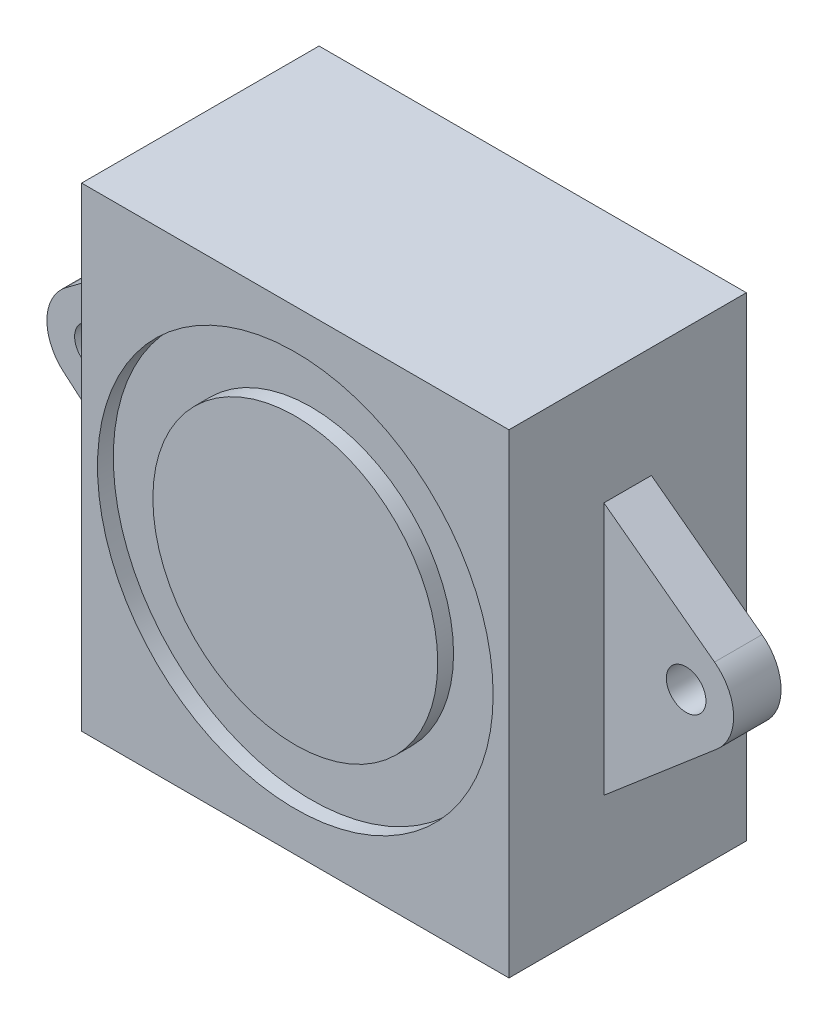
ISO-10303-21;
HEADER;
FILE_DESCRIPTION(('STEP AP214'),'2;1');
FILE_NAME('part.step','',(''),(''),'','','');
FILE_SCHEMA(('AUTOMOTIVE_DESIGN { 1 0 10303 214 1 1 1 1 }'));
ENDSEC;
DATA;
#1=APPLICATION_CONTEXT('core data for automotive mechanical design processes');
#2=APPLICATION_PROTOCOL_DEFINITION('international standard','automotive_design',2000,#1);
#3=PRODUCT_CONTEXT('',#1,'mechanical');
#4=PRODUCT('Part','Part','',(#3));
#5=PRODUCT_RELATED_PRODUCT_CATEGORY('part','',(#4));
#6=PRODUCT_DEFINITION_FORMATION('','',#4);
#7=PRODUCT_DEFINITION_CONTEXT('part definition',#1,'design');
#8=PRODUCT_DEFINITION('design','',#6,#7);
#9=PRODUCT_DEFINITION_SHAPE('','',#8);
#10=(LENGTH_UNIT() NAMED_UNIT(*) SI_UNIT(.MILLI.,.METRE.));
#11=(NAMED_UNIT(*) PLANE_ANGLE_UNIT() SI_UNIT($,.RADIAN.));
#12=(NAMED_UNIT(*) SI_UNIT($,.STERADIAN.) SOLID_ANGLE_UNIT());
#13=UNCERTAINTY_MEASURE_WITH_UNIT(LENGTH_MEASURE(1.E-05),#10,'distance_accuracy_value','');
#14=(GEOMETRIC_REPRESENTATION_CONTEXT(3) GLOBAL_UNCERTAINTY_ASSIGNED_CONTEXT((#13)) GLOBAL_UNIT_ASSIGNED_CONTEXT((#10,
#11,#12)) REPRESENTATION_CONTEXT('',''));
#15=CARTESIAN_POINT('',(0.,0.,0.));
#16=DIRECTION('',(0.,0.,1.));
#17=DIRECTION('',(1.,0.,0.));
#18=AXIS2_PLACEMENT_3D('',#15,#16,#17);
#19=CARTESIAN_POINT('',(-11.0249303933751,14.7712245140367,6.));
#20=DIRECTION('',(-0.598141159941193,0.801390761603978,0.));
#21=DIRECTION('',(-0.801390761603978,-0.598141159941193,0.));
#22=AXIS2_PLACEMENT_3D('',#19,#20,#21);
#23=PLANE('',#22);
#24=DIRECTION('',(0.,0.,1.));
#25=VECTOR('',#24,1.);
#26=CARTESIAN_POINT('',(-6.98951234528994,17.7831754221033,6.));
#27=LINE('',#26,#25);
#28=CARTESIAN_POINT('',(-6.98951234528994,17.7831754221033,6.));
#29=VERTEX_POINT('',#28);
#30=CARTESIAN_POINT('',(-6.98951234528994,17.7831754221033,9.));
#31=VERTEX_POINT('',#30);
#32=EDGE_CURVE('E140',#29,#31,#27,.T.);
#33=ORIENTED_EDGE('',*,*,#32,.T.);
#34=DIRECTION('',(0.801390761603978,0.598141159941193,0.));
#35=VECTOR('',#34,1.);
#36=CARTESIAN_POINT('',(-11.0249303933751,14.7712245140367,9.));
#37=LINE('',#36,#35);
#38=CARTESIAN_POINT('',(0.,23.,9.));
#39=VERTEX_POINT('',#38);
#40=EDGE_CURVE('E52',#31,#39,#37,.T.);
#41=ORIENTED_EDGE('',*,*,#40,.T.);
#42=DIRECTION('',(0.,0.,1.));
#43=VECTOR('',#42,1.);
#44=CARTESIAN_POINT('',(0.,23.,6.));
#45=LINE('',#44,#43);
#46=CARTESIAN_POINT('',(0.,23.,6.));
#47=VERTEX_POINT('',#46);
#48=EDGE_CURVE('E138',#47,#39,#45,.T.);
#49=ORIENTED_EDGE('',*,*,#48,.F.);
#50=DIRECTION('',(-0.801390761603978,-0.598141159941193,0.));
#51=VECTOR('',#50,1.);
#52=CARTESIAN_POINT('',(-11.0249303933751,14.7712245140367,6.));
#53=LINE('',#52,#51);
#54=EDGE_CURVE('E235',#47,#29,#53,.T.);
#55=ORIENTED_EDGE('',*,*,#54,.T.);
#56=EDGE_LOOP('',(#33,#41,#49,#55));
#57=FACE_BOUND('',#56,.T.);
#58=ADVANCED_FACE('F37',(#57),#23,.T.);
#59=CARTESIAN_POINT('',(3.45661763723507,4.04935827103577,6.));
#60=DIRECTION('',(-0.649245906413656,-0.760578564650037,0.));
#61=DIRECTION('',(0.760578564650037,-0.649245906413656,0.));
#62=AXIS2_PLACEMENT_3D('',#59,#60,#61);
#63=PLANE('',#62);
#64=DIRECTION('',(0.,0.,1.));
#65=VECTOR('',#64,1.);
#66=CARTESIAN_POINT('',(0.,7.,6.));
#67=LINE('',#66,#65);
#68=CARTESIAN_POINT('',(0.,7.,6.));
#69=VERTEX_POINT('',#68);
#70=CARTESIAN_POINT('',(0.,7.,9.));
#71=VERTEX_POINT('',#70);
#72=EDGE_CURVE('E146',#69,#71,#67,.T.);
#73=ORIENTED_EDGE('',*,*,#72,.T.);
#74=DIRECTION('',(-0.760578564650037,0.649245906413656,0.));
#75=VECTOR('',#74,1.);
#76=CARTESIAN_POINT('',(3.45661763723507,4.04935827103577,9.));
#77=LINE('',#76,#75);
#78=CARTESIAN_POINT('',(-7.14282658470733,13.0972674433412,9.));
#79=VERTEX_POINT('',#78);
#80=EDGE_CURVE('E127',#71,#79,#77,.T.);
#81=ORIENTED_EDGE('',*,*,#80,.T.);
#82=DIRECTION('',(0.,0.,1.));
#83=VECTOR('',#82,1.);
#84=CARTESIAN_POINT('',(-7.14282658470733,13.0972674433412,6.));
#85=LINE('',#84,#83);
#86=CARTESIAN_POINT('',(-7.14282658470733,13.0972674433412,6.));
#87=VERTEX_POINT('',#86);
#88=EDGE_CURVE('E151',#87,#79,#85,.T.);
#89=ORIENTED_EDGE('',*,*,#88,.F.);
#90=DIRECTION('',(0.760578564650037,-0.649245906413656,0.));
#91=VECTOR('',#90,1.);
#92=CARTESIAN_POINT('',(3.45661763723507,4.04935827103577,6.));
#93=LINE('',#92,#91);
#94=EDGE_CURVE('E239',#87,#69,#93,.T.);
#95=ORIENTED_EDGE('',*,*,#94,.T.);
#96=EDGE_LOOP('',(#73,#81,#89,#95));
#97=FACE_BOUND('',#96,.T.);
#98=ADVANCED_FACE('F248',(#97),#63,.T.);
#99=CARTESIAN_POINT('',(-5.19508886546636,15.3790031372913,6.));
#100=DIRECTION('',(0.,0.,1.));
#101=DIRECTION('',(1.,0.,0.));
#102=AXIS2_PLACEMENT_3D('',#99,#100,#101);
#103=CYLINDRICAL_SURFACE('',#102,1.25);
#104=CARTESIAN_POINT('',(-5.19508886546636,15.3790031372913,6.));
#105=DIRECTION('',(0.,0.,1.));
#106=DIRECTION('',(1.,0.,0.));
#107=AXIS2_PLACEMENT_3D('',#104,#105,#106);
#108=CIRCLE('',#107,1.25);
#109=CARTESIAN_POINT('',(-3.94508886546636,15.3790031372913,6.));
#110=VERTEX_POINT('',#109);
#111=EDGE_CURVE('E224',#110,#110,#108,.T.);
#112=ORIENTED_EDGE('',*,*,#111,.F.);
#113=EDGE_LOOP('',(#112));
#114=FACE_BOUND('',#113,.T.);
#115=CARTESIAN_POINT('',(-5.19508886546636,15.3790031372913,9.));
#116=DIRECTION('',(0.,0.,1.));
#117=DIRECTION('',(1.,0.,0.));
#118=AXIS2_PLACEMENT_3D('',#115,#116,#117);
#119=CIRCLE('',#118,1.25);
#120=CARTESIAN_POINT('',(-3.94508886546636,15.3790031372913,9.));
#121=VERTEX_POINT('',#120);
#122=EDGE_CURVE('E141',#121,#121,#119,.F.);
#123=ORIENTED_EDGE('',*,*,#122,.F.);
#124=EDGE_LOOP('',(#123));
#125=FACE_BOUND('',#124,.T.);
#126=ADVANCED_FACE('F250',(#114,#125),#103,.F.);
#127=CARTESIAN_POINT('',(-5.19508886546636,15.3790031372913,6.));
#128=DIRECTION('',(0.,0.,1.));
#129=DIRECTION('',(1.,0.,0.));
#130=AXIS2_PLACEMENT_3D('',#127,#128,#129);
#131=CYLINDRICAL_SURFACE('',#130,3.);
#132=ORIENTED_EDGE('',*,*,#88,.T.);
#133=CARTESIAN_POINT('',(-5.19508886546636,15.3790031372913,9.));
#134=DIRECTION('',(0.,0.,1.));
#135=DIRECTION('',(1.,0.,0.));
#136=AXIS2_PLACEMENT_3D('',#133,#134,#135);
#137=CIRCLE('',#136,3.);
#138=EDGE_CURVE('E11',#79,#31,#137,.F.);
#139=ORIENTED_EDGE('',*,*,#138,.T.);
#140=ORIENTED_EDGE('',*,*,#32,.F.);
#141=CARTESIAN_POINT('',(-5.19508886546636,15.3790031372913,6.));
#142=DIRECTION('',(0.,0.,1.));
#143=DIRECTION('',(1.,0.,0.));
#144=AXIS2_PLACEMENT_3D('',#141,#142,#143);
#145=CIRCLE('',#144,3.);
#146=EDGE_CURVE('E237',#29,#87,#145,.T.);
#147=ORIENTED_EDGE('',*,*,#146,.T.);
#148=EDGE_LOOP('',(#132,#139,#140,#147));
#149=FACE_BOUND('',#148,.T.);
#150=ADVANCED_FACE('F247',(#149),#131,.T.);
#151=CARTESIAN_POINT('',(32.1950888654664,15.3790031372913,6.));
#152=DIRECTION('',(0.,0.,1.));
#153=DIRECTION('',(1.,0.,0.));
#154=AXIS2_PLACEMENT_3D('',#151,#152,#153);
#155=CYLINDRICAL_SURFACE('',#154,3.);
#156=CARTESIAN_POINT('',(32.1950888654664,15.3790031372913,9.));
#157=DIRECTION('',(0.,0.,1.));
#158=DIRECTION('',(1.,0.,0.));
#159=AXIS2_PLACEMENT_3D('',#156,#157,#158);
#160=CIRCLE('',#159,3.);
#161=CARTESIAN_POINT('',(34.1428265847073,13.0972674433412,9.));
#162=VERTEX_POINT('',#161);
#163=CARTESIAN_POINT('',(33.9895123452899,17.7831754221033,9.));
#164=VERTEX_POINT('',#163);
#165=EDGE_CURVE('E59',#162,#164,#160,.T.);
#166=ORIENTED_EDGE('',*,*,#165,.F.);
#167=DIRECTION('',(0.,0.,1.));
#168=VECTOR('',#167,1.);
#169=CARTESIAN_POINT('',(34.1428265847073,13.0972674433412,6.));
#170=LINE('',#169,#168);
#171=CARTESIAN_POINT('',(34.1428265847073,13.0972674433412,6.));
#172=VERTEX_POINT('',#171);
#173=EDGE_CURVE('E221',#172,#162,#170,.T.);
#174=ORIENTED_EDGE('',*,*,#173,.F.);
#175=CARTESIAN_POINT('',(32.1950888654664,15.3790031372913,6.));
#176=DIRECTION('',(0.,0.,1.));
#177=DIRECTION('',(1.,0.,0.));
#178=AXIS2_PLACEMENT_3D('',#175,#176,#177);
#179=CIRCLE('',#178,3.);
#180=CARTESIAN_POINT('',(33.9895123452899,17.7831754221033,6.));
#181=VERTEX_POINT('',#180);
#182=EDGE_CURVE('E208',#181,#172,#179,.F.);
#183=ORIENTED_EDGE('',*,*,#182,.F.);
#184=DIRECTION('',(0.,0.,1.));
#185=VECTOR('',#184,1.);
#186=CARTESIAN_POINT('',(33.9895123452899,17.7831754221033,6.));
#187=LINE('',#186,#185);
#188=EDGE_CURVE('E220',#181,#164,#187,.T.);
#189=ORIENTED_EDGE('',*,*,#188,.T.);
#190=EDGE_LOOP('',(#166,#174,#183,#189));
#191=FACE_BOUND('',#190,.T.);
#192=ADVANCED_FACE('F263',(#191),#155,.T.);
#193=CARTESIAN_POINT('',(7.92442903162695,-9.28330975829951,6.));
#194=DIRECTION('',(-0.649245906413656,0.760578564650037,0.));
#195=DIRECTION('',(-0.760578564650037,-0.649245906413656,0.));
#196=AXIS2_PLACEMENT_3D('',#193,#194,#195);
#197=PLANE('',#196);
#198=DIRECTION('',(0.760578564650037,0.649245906413656,0.));
#199=VECTOR('',#198,1.);
#200=CARTESIAN_POINT('',(7.92442903162695,-9.28330975829951,9.));
#201=LINE('',#200,#199);
#202=CARTESIAN_POINT('',(27.,7.,9.));
#203=VERTEX_POINT('',#202);
#204=EDGE_CURVE('E200',#203,#162,#201,.T.);
#205=ORIENTED_EDGE('',*,*,#204,.F.);
#206=DIRECTION('',(0.,0.,1.));
#207=VECTOR('',#206,1.);
#208=CARTESIAN_POINT('',(27.,7.,6.));
#209=LINE('',#208,#207);
#210=CARTESIAN_POINT('',(27.,7.,6.));
#211=VERTEX_POINT('',#210);
#212=EDGE_CURVE('E225',#211,#203,#209,.T.);
#213=ORIENTED_EDGE('',*,*,#212,.F.);
#214=DIRECTION('',(-0.760578564650037,-0.649245906413656,0.));
#215=VECTOR('',#214,1.);
#216=CARTESIAN_POINT('',(7.92442903162695,-9.28330975829951,6.));
#217=LINE('',#216,#215);
#218=EDGE_CURVE('E215',#172,#211,#217,.T.);
#219=ORIENTED_EDGE('',*,*,#218,.F.);
#220=ORIENTED_EDGE('',*,*,#173,.T.);
#221=EDGE_LOOP('',(#205,#213,#219,#220));
#222=FACE_BOUND('',#221,.T.);
#223=ADVANCED_FACE('F328',(#222),#197,.F.);
#224=CARTESIAN_POINT('',(20.6847972682016,27.7135341062596,6.));
#225=DIRECTION('',(-0.598141159941193,-0.801390761603978,0.));
#226=DIRECTION('',(0.801390761603978,-0.598141159941193,0.));
#227=AXIS2_PLACEMENT_3D('',#224,#225,#226);
#228=PLANE('',#227);
#229=DIRECTION('',(-0.801390761603978,0.598141159941193,0.));
#230=VECTOR('',#229,1.);
#231=CARTESIAN_POINT('',(20.6847972682016,27.7135341062596,9.));
#232=LINE('',#231,#230);
#233=CARTESIAN_POINT('',(27.,23.,9.));
#234=VERTEX_POINT('',#233);
#235=EDGE_CURVE('E195',#164,#234,#232,.T.);
#236=ORIENTED_EDGE('',*,*,#235,.F.);
#237=ORIENTED_EDGE('',*,*,#188,.F.);
#238=DIRECTION('',(0.801390761603978,-0.598141159941193,0.));
#239=VECTOR('',#238,1.);
#240=CARTESIAN_POINT('',(20.6847972682016,27.7135341062596,6.));
#241=LINE('',#240,#239);
#242=CARTESIAN_POINT('',(27.,23.,6.));
#243=VERTEX_POINT('',#242);
#244=EDGE_CURVE('E211',#243,#181,#241,.T.);
#245=ORIENTED_EDGE('',*,*,#244,.F.);
#246=DIRECTION('',(0.,0.,1.));
#247=VECTOR('',#246,1.);
#248=CARTESIAN_POINT('',(27.,23.,6.));
#249=LINE('',#248,#247);
#250=EDGE_CURVE('E228',#243,#234,#249,.T.);
#251=ORIENTED_EDGE('',*,*,#250,.T.);
#252=EDGE_LOOP('',(#236,#237,#245,#251));
#253=FACE_BOUND('',#252,.T.);
#254=ADVANCED_FACE('F318',(#253),#228,.F.);
#255=CARTESIAN_POINT('',(32.1950888654664,15.3790031372913,6.));
#256=DIRECTION('',(0.,0.,1.));
#257=DIRECTION('',(1.,0.,0.));
#258=AXIS2_PLACEMENT_3D('',#255,#256,#257);
#259=CYLINDRICAL_SURFACE('',#258,1.25);
#260=CARTESIAN_POINT('',(32.1950888654664,15.3790031372913,6.));
#261=DIRECTION('',(0.,0.,1.));
#262=DIRECTION('',(1.,0.,0.));
#263=AXIS2_PLACEMENT_3D('',#260,#261,#262);
#264=CIRCLE('',#263,1.25);
#265=CARTESIAN_POINT('',(33.4450888654664,15.3790031372913,6.));
#266=VERTEX_POINT('',#265);
#267=EDGE_CURVE('E217',#266,#266,#264,.F.);
#268=ORIENTED_EDGE('',*,*,#267,.T.);
#269=EDGE_LOOP('',(#268));
#270=FACE_BOUND('',#269,.T.);
#271=CARTESIAN_POINT('',(32.1950888654664,15.3790031372913,9.));
#272=DIRECTION('',(0.,0.,1.));
#273=DIRECTION('',(1.,0.,0.));
#274=AXIS2_PLACEMENT_3D('',#271,#272,#273);
#275=CIRCLE('',#274,1.25);
#276=CARTESIAN_POINT('',(33.4450888654664,15.3790031372913,9.));
#277=VERTEX_POINT('',#276);
#278=EDGE_CURVE('E132',#277,#277,#275,.T.);
#279=ORIENTED_EDGE('',*,*,#278,.T.);
#280=EDGE_LOOP('',(#279));
#281=FACE_BOUND('',#280,.T.);
#282=ADVANCED_FACE('F293',(#270,#281),#259,.F.);
#283=CARTESIAN_POINT('',(27.,0.,15.));
#284=DIRECTION('',(-1.,0.,0.));
#285=DIRECTION('',(0.,0.,1.));
#286=AXIS2_PLACEMENT_3D('',#283,#284,#285);
#287=PLANE('',#286);
#288=DIRECTION('',(0.,0.,-1.));
#289=VECTOR('',#288,1.);
#290=CARTESIAN_POINT('',(27.,30.,15.));
#291=LINE('',#290,#289);
#292=CARTESIAN_POINT('',(27.,30.,15.));
#293=VERTEX_POINT('',#292);
#294=CARTESIAN_POINT('',(27.,30.,0.));
#295=VERTEX_POINT('',#294);
#296=EDGE_CURVE('E187',#293,#295,#291,.T.);
#297=ORIENTED_EDGE('',*,*,#296,.F.);
#298=DIRECTION('',(0.,1.,0.));
#299=VECTOR('',#298,1.);
#300=CARTESIAN_POINT('',(27.,0.,15.));
#301=LINE('',#300,#299);
#302=CARTESIAN_POINT('',(27.,0.,15.));
#303=VERTEX_POINT('',#302);
#304=EDGE_CURVE('E173',#303,#293,#301,.T.);
#305=ORIENTED_EDGE('',*,*,#304,.F.);
#306=DIRECTION('',(0.,0.,-1.));
#307=VECTOR('',#306,1.);
#308=CARTESIAN_POINT('',(27.,0.,15.));
#309=LINE('',#308,#307);
#310=CARTESIAN_POINT('',(27.,0.,0.));
#311=VERTEX_POINT('',#310);
#312=EDGE_CURVE('E190',#303,#311,#309,.T.);
#313=ORIENTED_EDGE('',*,*,#312,.T.);
#314=DIRECTION('',(0.,1.,0.));
#315=VECTOR('',#314,1.);
#316=CARTESIAN_POINT('',(27.,0.,0.));
#317=LINE('',#316,#315);
#318=EDGE_CURVE('E182',#311,#295,#317,.T.);
#319=ORIENTED_EDGE('',*,*,#318,.T.);
#320=EDGE_LOOP('',(#297,#305,#313,#319));
#321=FACE_BOUND('',#320,.T.);
#322=ORIENTED_EDGE('',*,*,#250,.F.);
#323=DIRECTION('',(0.,1.,0.));
#324=VECTOR('',#323,1.);
#325=CARTESIAN_POINT('',(27.,0.,6.));
#326=LINE('',#325,#324);
#327=EDGE_CURVE('E213',#211,#243,#326,.T.);
#328=ORIENTED_EDGE('',*,*,#327,.F.);
#329=ORIENTED_EDGE('',*,*,#212,.T.);
#330=DIRECTION('',(0.,-1.,0.));
#331=VECTOR('',#330,1.);
#332=CARTESIAN_POINT('',(27.,23.,9.));
#333=LINE('',#332,#331);
#334=EDGE_CURVE('E133',#234,#203,#333,.T.);
#335=ORIENTED_EDGE('',*,*,#334,.F.);
#336=EDGE_LOOP('',(#322,#328,#329,#335));
#337=FACE_BOUND('',#336,.T.);
#338=ADVANCED_FACE('F291',(#321,#337),#287,.F.);
#339=CARTESIAN_POINT('',(0.,0.,15.));
#340=DIRECTION('',(1.,0.,0.));
#341=DIRECTION('',(0.,0.,-1.));
#342=AXIS2_PLACEMENT_3D('',#339,#340,#341);
#343=PLANE('',#342);
#344=DIRECTION('',(0.,0.,-1.));
#345=VECTOR('',#344,1.);
#346=CARTESIAN_POINT('',(0.,0.,15.));
#347=LINE('',#346,#345);
#348=CARTESIAN_POINT('',(0.,0.,15.));
#349=VERTEX_POINT('',#348);
#350=CARTESIAN_POINT('',(0.,0.,0.));
#351=VERTEX_POINT('',#350);
#352=EDGE_CURVE('E45',#349,#351,#347,.T.);
#353=ORIENTED_EDGE('',*,*,#352,.F.);
#354=DIRECTION('',(0.,-1.,0.));
#355=VECTOR('',#354,1.);
#356=CARTESIAN_POINT('',(0.,0.,15.));
#357=LINE('',#356,#355);
#358=CARTESIAN_POINT('',(0.,30.,15.));
#359=VERTEX_POINT('',#358);
#360=EDGE_CURVE('E168',#359,#349,#357,.T.);
#361=ORIENTED_EDGE('',*,*,#360,.F.);
#362=DIRECTION('',(0.,0.,-1.));
#363=VECTOR('',#362,1.);
#364=CARTESIAN_POINT('',(0.,30.,15.));
#365=LINE('',#364,#363);
#366=CARTESIAN_POINT('',(0.,30.,0.));
#367=VERTEX_POINT('',#366);
#368=EDGE_CURVE('E177',#359,#367,#365,.T.);
#369=ORIENTED_EDGE('',*,*,#368,.T.);
#370=DIRECTION('',(0.,-1.,0.));
#371=VECTOR('',#370,1.);
#372=CARTESIAN_POINT('',(0.,0.,0.));
#373=LINE('',#372,#371);
#374=EDGE_CURVE('E165',#367,#351,#373,.T.);
#375=ORIENTED_EDGE('',*,*,#374,.T.);
#376=EDGE_LOOP('',(#353,#361,#369,#375));
#377=FACE_BOUND('',#376,.T.);
#378=ORIENTED_EDGE('',*,*,#72,.F.);
#379=DIRECTION('',(0.,-1.,0.));
#380=VECTOR('',#379,1.);
#381=CARTESIAN_POINT('',(0.,0.,6.));
#382=LINE('',#381,#380);
#383=EDGE_CURVE('E144',#47,#69,#382,.T.);
#384=ORIENTED_EDGE('',*,*,#383,.F.);
#385=ORIENTED_EDGE('',*,*,#48,.T.);
#386=DIRECTION('',(0.,1.,0.));
#387=VECTOR('',#386,1.);
#388=CARTESIAN_POINT('',(0.,7.,9.));
#389=LINE('',#388,#387);
#390=EDGE_CURVE('E123',#71,#39,#389,.T.);
#391=ORIENTED_EDGE('',*,*,#390,.F.);
#392=EDGE_LOOP('',(#378,#384,#385,#391));
#393=FACE_BOUND('',#392,.T.);
#394=ADVANCED_FACE('F39',(#377,#393),#343,.F.);
#395=CARTESIAN_POINT('',(0.,0.,15.));
#396=DIRECTION('',(0.,1.,0.));
#397=DIRECTION('',(0.,0.,1.));
#398=AXIS2_PLACEMENT_3D('',#395,#396,#397);
#399=PLANE('',#398);
#400=DIRECTION('',(1.,0.,0.));
#401=VECTOR('',#400,1.);
#402=CARTESIAN_POINT('',(0.,0.,0.));
#403=LINE('',#402,#401);
#404=EDGE_CURVE('E180',#351,#311,#403,.T.);
#405=ORIENTED_EDGE('',*,*,#404,.T.);
#406=ORIENTED_EDGE('',*,*,#312,.F.);
#407=DIRECTION('',(1.,0.,0.));
#408=VECTOR('',#407,1.);
#409=CARTESIAN_POINT('',(0.,0.,15.));
#410=LINE('',#409,#408);
#411=EDGE_CURVE('E170',#349,#303,#410,.T.);
#412=ORIENTED_EDGE('',*,*,#411,.F.);
#413=ORIENTED_EDGE('',*,*,#352,.T.);
#414=EDGE_LOOP('',(#405,#406,#412,#413));
#415=FACE_BOUND('',#414,.T.);
#416=ADVANCED_FACE('F289',(#415),#399,.F.);
#417=CARTESIAN_POINT('',(0.,30.,15.));
#418=DIRECTION('',(0.,-1.,0.));
#419=DIRECTION('',(0.,0.,-1.));
#420=AXIS2_PLACEMENT_3D('',#417,#418,#419);
#421=PLANE('',#420);
#422=DIRECTION('',(-1.,0.,0.));
#423=VECTOR('',#422,1.);
#424=CARTESIAN_POINT('',(0.,30.,0.));
#425=LINE('',#424,#423);
#426=EDGE_CURVE('E171',#295,#367,#425,.T.);
#427=ORIENTED_EDGE('',*,*,#426,.T.);
#428=ORIENTED_EDGE('',*,*,#368,.F.);
#429=DIRECTION('',(-1.,0.,0.));
#430=VECTOR('',#429,1.);
#431=CARTESIAN_POINT('',(0.,30.,15.));
#432=LINE('',#431,#430);
#433=EDGE_CURVE('E175',#293,#359,#432,.T.);
#434=ORIENTED_EDGE('',*,*,#433,.F.);
#435=ORIENTED_EDGE('',*,*,#296,.T.);
#436=EDGE_LOOP('',(#427,#428,#434,#435));
#437=FACE_BOUND('',#436,.T.);
#438=ADVANCED_FACE('F282',(#437),#421,.F.);
#439=CARTESIAN_POINT('',(0.,0.,15.));
#440=DIRECTION('',(0.,0.,-1.));
#441=DIRECTION('',(-1.,0.,0.));
#442=AXIS2_PLACEMENT_3D('',#439,#440,#441);
#443=PLANE('',#442);
#444=CARTESIAN_POINT('',(13.5,15.,15.));
#445=DIRECTION('',(0.,0.,1.));
#446=DIRECTION('',(1.,0.,0.));
#447=AXIS2_PLACEMENT_3D('',#444,#445,#446);
#448=CIRCLE('',#447,12.5);
#449=CARTESIAN_POINT('',(26.,15.,15.));
#450=VERTEX_POINT('',#449);
#451=EDGE_CURVE('E160',#450,#450,#448,.T.);
#452=ORIENTED_EDGE('',*,*,#451,.F.);
#453=EDGE_LOOP('',(#452));
#454=FACE_BOUND('',#453,.T.);
#455=ORIENTED_EDGE('',*,*,#360,.T.);
#456=ORIENTED_EDGE('',*,*,#411,.T.);
#457=ORIENTED_EDGE('',*,*,#304,.T.);
#458=ORIENTED_EDGE('',*,*,#433,.T.);
#459=EDGE_LOOP('',(#455,#456,#457,#458));
#460=FACE_BOUND('',#459,.T.);
#461=ADVANCED_FACE('F279',(#454,#460),#443,.F.);
#462=CARTESIAN_POINT('',(0.,0.,0.));
#463=DIRECTION('',(0.,0.,-1.));
#464=DIRECTION('',(-1.,0.,0.));
#465=AXIS2_PLACEMENT_3D('',#462,#463,#464);
#466=PLANE('',#465);
#467=ORIENTED_EDGE('',*,*,#374,.F.);
#468=ORIENTED_EDGE('',*,*,#426,.F.);
#469=ORIENTED_EDGE('',*,*,#318,.F.);
#470=ORIENTED_EDGE('',*,*,#404,.F.);
#471=EDGE_LOOP('',(#467,#468,#469,#470));
#472=FACE_BOUND('',#471,.T.);
#473=ADVANCED_FACE('F277',(#472),#466,.T.);
#474=CARTESIAN_POINT('',(13.5,15.,14.));
#475=DIRECTION('',(0.,0.,1.));
#476=DIRECTION('',(1.,0.,0.));
#477=AXIS2_PLACEMENT_3D('',#474,#475,#476);
#478=CYLINDRICAL_SURFACE('',#477,12.5);
#479=CARTESIAN_POINT('',(13.5,15.,14.));
#480=DIRECTION('',(0.,0.,1.));
#481=DIRECTION('',(1.,0.,0.));
#482=AXIS2_PLACEMENT_3D('',#479,#480,#481);
#483=CIRCLE('',#482,12.5);
#484=CARTESIAN_POINT('',(26.,15.,14.));
#485=VERTEX_POINT('',#484);
#486=EDGE_CURVE('E162',#485,#485,#483,.T.);
#487=ORIENTED_EDGE('',*,*,#486,.F.);
#488=EDGE_LOOP('',(#487));
#489=FACE_BOUND('',#488,.T.);
#490=ORIENTED_EDGE('',*,*,#451,.T.);
#491=EDGE_LOOP('',(#490));
#492=FACE_BOUND('',#491,.T.);
#493=ADVANCED_FACE('F273',(#489,#492),#478,.F.);
#494=CARTESIAN_POINT('',(13.5,15.,14.));
#495=DIRECTION('',(0.,0.,1.));
#496=DIRECTION('',(1.,0.,0.));
#497=AXIS2_PLACEMENT_3D('',#494,#495,#496);
#498=PLANE('',#497);
#499=CARTESIAN_POINT('',(13.5,15.,14.));
#500=DIRECTION('',(0.,0.,1.));
#501=DIRECTION('',(1.,0.,0.));
#502=AXIS2_PLACEMENT_3D('',#499,#500,#501);
#503=CIRCLE('',#502,9.);
#504=CARTESIAN_POINT('',(22.5,15.,14.));
#505=VERTEX_POINT('',#504);
#506=EDGE_CURVE('E149',#505,#505,#503,.T.);
#507=ORIENTED_EDGE('',*,*,#506,.F.);
#508=EDGE_LOOP('',(#507));
#509=FACE_BOUND('',#508,.T.);
#510=ORIENTED_EDGE('',*,*,#486,.T.);
#511=EDGE_LOOP('',(#510));
#512=FACE_BOUND('',#511,.T.);
#513=ADVANCED_FACE('F269',(#509,#512),#498,.T.);
#514=CARTESIAN_POINT('',(13.5,15.,14.));
#515=DIRECTION('',(0.,0.,1.));
#516=DIRECTION('',(1.,0.,0.));
#517=AXIS2_PLACEMENT_3D('',#514,#515,#516);
#518=CYLINDRICAL_SURFACE('',#517,9.);
#519=ORIENTED_EDGE('',*,*,#506,.T.);
#520=EDGE_LOOP('',(#519));
#521=FACE_BOUND('',#520,.T.);
#522=CARTESIAN_POINT('',(13.5,15.,15.));
#523=DIRECTION('',(0.,0.,1.));
#524=DIRECTION('',(1.,0.,0.));
#525=AXIS2_PLACEMENT_3D('',#522,#523,#524);
#526=CIRCLE('',#525,9.);
#527=CARTESIAN_POINT('',(22.5,15.,15.));
#528=VERTEX_POINT('',#527);
#529=EDGE_CURVE('E145',#528,#528,#526,.T.);
#530=ORIENTED_EDGE('',*,*,#529,.F.);
#531=EDGE_LOOP('',(#530));
#532=FACE_BOUND('',#531,.T.);
#533=ADVANCED_FACE('F265',(#521,#532),#518,.T.);
#534=ORIENTED_EDGE('',*,*,#529,.T.);
#535=EDGE_LOOP('',(#534));
#536=FACE_BOUND('',#535,.T.);
#537=ADVANCED_FACE('F268',(#536),#443,.F.);
#538=CARTESIAN_POINT('',(0.,0.,6.));
#539=DIRECTION('',(0.,0.,1.));
#540=DIRECTION('',(1.,0.,0.));
#541=AXIS2_PLACEMENT_3D('',#538,#539,#540);
#542=PLANE('',#541);
#543=ORIENTED_EDGE('',*,*,#111,.T.);
#544=EDGE_LOOP('',(#543));
#545=FACE_BOUND('',#544,.T.);
#546=ORIENTED_EDGE('',*,*,#54,.F.);
#547=ORIENTED_EDGE('',*,*,#383,.T.);
#548=ORIENTED_EDGE('',*,*,#94,.F.);
#549=ORIENTED_EDGE('',*,*,#146,.F.);
#550=EDGE_LOOP('',(#546,#547,#548,#549));
#551=FACE_BOUND('',#550,.T.);
#552=ADVANCED_FACE('F244',(#545,#551),#542,.F.);
#553=CARTESIAN_POINT('',(0.,0.,6.));
#554=DIRECTION('',(0.,0.,1.));
#555=DIRECTION('',(1.,0.,0.));
#556=AXIS2_PLACEMENT_3D('',#553,#554,#555);
#557=PLANE('',#556);
#558=ORIENTED_EDGE('',*,*,#182,.T.);
#559=ORIENTED_EDGE('',*,*,#218,.T.);
#560=ORIENTED_EDGE('',*,*,#327,.T.);
#561=ORIENTED_EDGE('',*,*,#244,.T.);
#562=EDGE_LOOP('',(#558,#559,#560,#561));
#563=FACE_BOUND('',#562,.T.);
#564=ORIENTED_EDGE('',*,*,#267,.F.);
#565=EDGE_LOOP('',(#564));
#566=FACE_BOUND('',#565,.T.);
#567=ADVANCED_FACE('F322',(#563,#566),#557,.F.);
#568=CARTESIAN_POINT('',(0.,0.,9.));
#569=DIRECTION('',(0.,0.,1.));
#570=DIRECTION('',(1.,0.,0.));
#571=AXIS2_PLACEMENT_3D('',#568,#569,#570);
#572=PLANE('',#571);
#573=ORIENTED_EDGE('',*,*,#278,.F.);
#574=EDGE_LOOP('',(#573));
#575=FACE_BOUND('',#574,.T.);
#576=ORIENTED_EDGE('',*,*,#204,.T.);
#577=ORIENTED_EDGE('',*,*,#165,.T.);
#578=ORIENTED_EDGE('',*,*,#235,.T.);
#579=ORIENTED_EDGE('',*,*,#334,.T.);
#580=EDGE_LOOP('',(#576,#577,#578,#579));
#581=FACE_BOUND('',#580,.T.);
#582=ADVANCED_FACE('F329',(#575,#581),#572,.T.);
#583=CARTESIAN_POINT('',(0.,0.,9.));
#584=DIRECTION('',(0.,0.,1.));
#585=DIRECTION('',(1.,0.,0.));
#586=AXIS2_PLACEMENT_3D('',#583,#584,#585);
#587=PLANE('',#586);
#588=ORIENTED_EDGE('',*,*,#138,.F.);
#589=ORIENTED_EDGE('',*,*,#80,.F.);
#590=ORIENTED_EDGE('',*,*,#390,.T.);
#591=ORIENTED_EDGE('',*,*,#40,.F.);
#592=EDGE_LOOP('',(#588,#589,#590,#591));
#593=FACE_BOUND('',#592,.T.);
#594=ORIENTED_EDGE('',*,*,#122,.T.);
#595=EDGE_LOOP('',(#594));
#596=FACE_BOUND('',#595,.T.);
#597=ADVANCED_FACE('F124',(#593,#596),#587,.T.);
#598=CLOSED_SHELL('',(#58,#98,#126,#150,#192,#223,#254,#282,#338,#394,#416,#438,#461,#473,#493,
#513,#533,#537,#552,#567,#582,#597));
#599=MANIFOLD_SOLID_BREP('B2',#598);
#600=ADVANCED_BREP_SHAPE_REPRESENTATION('',(#18,#599),#14);
#601=SHAPE_DEFINITION_REPRESENTATION(#9,#600);
ENDSEC;
END-ISO-10303-21;
